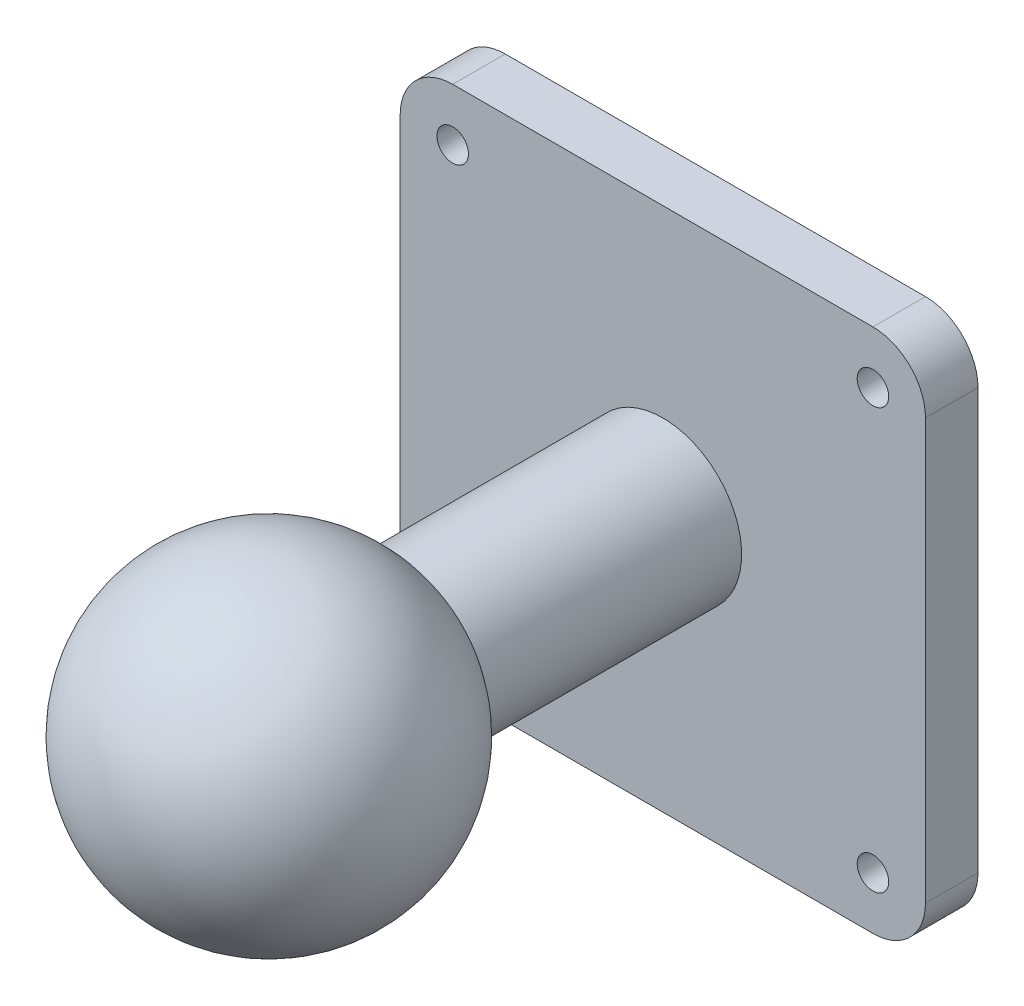
ISO-10303-21;
HEADER;
FILE_DESCRIPTION(('STEP AP214'),'2;1');
FILE_NAME('part.step','',(''),(''),'','','');
FILE_SCHEMA(('AUTOMOTIVE_DESIGN { 1 0 10303 214 1 1 1 1 }'));
ENDSEC;
DATA;
#1=APPLICATION_CONTEXT('core data for automotive mechanical design processes');
#2=APPLICATION_PROTOCOL_DEFINITION('international standard','automotive_design',2000,#1);
#3=PRODUCT_CONTEXT('',#1,'mechanical');
#4=PRODUCT('Part','Part','',(#3));
#5=PRODUCT_RELATED_PRODUCT_CATEGORY('part','',(#4));
#6=PRODUCT_DEFINITION_FORMATION('','',#4);
#7=PRODUCT_DEFINITION_CONTEXT('part definition',#1,'design');
#8=PRODUCT_DEFINITION('design','',#6,#7);
#9=PRODUCT_DEFINITION_SHAPE('','',#8);
#10=(LENGTH_UNIT() NAMED_UNIT(*) SI_UNIT(.MILLI.,.METRE.));
#11=(NAMED_UNIT(*) PLANE_ANGLE_UNIT() SI_UNIT($,.RADIAN.));
#12=(NAMED_UNIT(*) SI_UNIT($,.STERADIAN.) SOLID_ANGLE_UNIT());
#13=UNCERTAINTY_MEASURE_WITH_UNIT(LENGTH_MEASURE(1.E-05),#10,'distance_accuracy_value','');
#14=(GEOMETRIC_REPRESENTATION_CONTEXT(3) GLOBAL_UNCERTAINTY_ASSIGNED_CONTEXT((#13)) GLOBAL_UNIT_ASSIGNED_CONTEXT((#10,
#11,#12)) REPRESENTATION_CONTEXT('',''));
#15=CARTESIAN_POINT('',(0.,0.,0.));
#16=DIRECTION('',(0.,0.,1.));
#17=DIRECTION('',(1.,0.,0.));
#18=AXIS2_PLACEMENT_3D('',#15,#16,#17);
#19=CARTESIAN_POINT('',(25.,-25.,5.));
#20=DIRECTION('',(-1.,0.,0.));
#21=DIRECTION('',(0.,0.,1.));
#22=AXIS2_PLACEMENT_3D('',#19,#20,#21);
#23=PLANE('',#22);
#24=DIRECTION('',(0.,1.,0.));
#25=VECTOR('',#24,1.);
#26=CARTESIAN_POINT('',(25.,-25.,5.));
#27=LINE('',#26,#25);
#28=CARTESIAN_POINT('',(25.,-20.,5.));
#29=VERTEX_POINT('',#28);
#30=CARTESIAN_POINT('',(25.,20.,5.));
#31=VERTEX_POINT('',#30);
#32=EDGE_CURVE('E130',#29,#31,#27,.T.);
#33=ORIENTED_EDGE('',*,*,#32,.F.);
#34=DIRECTION('',(0.,0.,-1.));
#35=VECTOR('',#34,1.);
#36=CARTESIAN_POINT('',(25.,-20.,5.));
#37=LINE('',#36,#35);
#38=CARTESIAN_POINT('',(25.,-20.,0.));
#39=VERTEX_POINT('',#38);
#40=EDGE_CURVE('E115',#29,#39,#37,.T.);
#41=ORIENTED_EDGE('',*,*,#40,.T.);
#42=DIRECTION('',(0.,1.,0.));
#43=VECTOR('',#42,1.);
#44=CARTESIAN_POINT('',(25.,-25.,0.));
#45=LINE('',#44,#43);
#46=CARTESIAN_POINT('',(25.,20.,0.));
#47=VERTEX_POINT('',#46);
#48=EDGE_CURVE('E127',#39,#47,#45,.T.);
#49=ORIENTED_EDGE('',*,*,#48,.T.);
#50=DIRECTION('',(0.,0.,-1.));
#51=VECTOR('',#50,1.);
#52=CARTESIAN_POINT('',(25.,20.,5.));
#53=LINE('',#52,#51);
#54=EDGE_CURVE('E132',#47,#31,#53,.F.);
#55=ORIENTED_EDGE('',*,*,#54,.T.);
#56=EDGE_LOOP('',(#33,#41,#49,#55));
#57=FACE_BOUND('',#56,.T.);
#58=ADVANCED_FACE('F45',(#57),#23,.F.);
#59=CARTESIAN_POINT('',(-25.,25.,5.));
#60=DIRECTION('',(0.,-1.,0.));
#61=DIRECTION('',(0.,0.,-1.));
#62=AXIS2_PLACEMENT_3D('',#59,#60,#61);
#63=PLANE('',#62);
#64=DIRECTION('',(-1.,0.,0.));
#65=VECTOR('',#64,1.);
#66=CARTESIAN_POINT('',(-25.,25.,5.));
#67=LINE('',#66,#65);
#68=CARTESIAN_POINT('',(20.,25.,5.));
#69=VERTEX_POINT('',#68);
#70=CARTESIAN_POINT('',(-20.,25.,5.));
#71=VERTEX_POINT('',#70);
#72=EDGE_CURVE('E177',#69,#71,#67,.T.);
#73=ORIENTED_EDGE('',*,*,#72,.F.);
#74=DIRECTION('',(0.,0.,-1.));
#75=VECTOR('',#74,1.);
#76=CARTESIAN_POINT('',(20.,25.,5.));
#77=LINE('',#76,#75);
#78=CARTESIAN_POINT('',(20.,25.,0.));
#79=VERTEX_POINT('',#78);
#80=EDGE_CURVE('E170',#69,#79,#77,.T.);
#81=ORIENTED_EDGE('',*,*,#80,.T.);
#82=DIRECTION('',(-1.,0.,0.));
#83=VECTOR('',#82,1.);
#84=CARTESIAN_POINT('',(-25.,25.,0.));
#85=LINE('',#84,#83);
#86=CARTESIAN_POINT('',(-20.,25.,0.));
#87=VERTEX_POINT('',#86);
#88=EDGE_CURVE('E136',#79,#87,#85,.T.);
#89=ORIENTED_EDGE('',*,*,#88,.T.);
#90=DIRECTION('',(0.,0.,-1.));
#91=VECTOR('',#90,1.);
#92=CARTESIAN_POINT('',(-20.,25.,5.));
#93=LINE('',#92,#91);
#94=EDGE_CURVE('E168',#87,#71,#93,.F.);
#95=ORIENTED_EDGE('',*,*,#94,.T.);
#96=EDGE_LOOP('',(#73,#81,#89,#95));
#97=FACE_BOUND('',#96,.T.);
#98=ADVANCED_FACE('F175',(#97),#63,.F.);
#99=CARTESIAN_POINT('',(-25.,-25.,5.));
#100=DIRECTION('',(1.,0.,0.));
#101=DIRECTION('',(0.,0.,-1.));
#102=AXIS2_PLACEMENT_3D('',#99,#100,#101);
#103=PLANE('',#102);
#104=DIRECTION('',(0.,-1.,0.));
#105=VECTOR('',#104,1.);
#106=CARTESIAN_POINT('',(-25.,-25.,5.));
#107=LINE('',#106,#105);
#108=CARTESIAN_POINT('',(-25.,20.,5.));
#109=VERTEX_POINT('',#108);
#110=CARTESIAN_POINT('',(-25.,-20.,5.));
#111=VERTEX_POINT('',#110);
#112=EDGE_CURVE('E185',#109,#111,#107,.T.);
#113=ORIENTED_EDGE('',*,*,#112,.F.);
#114=DIRECTION('',(0.,0.,-1.));
#115=VECTOR('',#114,1.);
#116=CARTESIAN_POINT('',(-25.,20.,5.));
#117=LINE('',#116,#115);
#118=CARTESIAN_POINT('',(-25.,20.,0.));
#119=VERTEX_POINT('',#118);
#120=EDGE_CURVE('E11',#109,#119,#117,.T.);
#121=ORIENTED_EDGE('',*,*,#120,.T.);
#122=DIRECTION('',(0.,-1.,0.));
#123=VECTOR('',#122,1.);
#124=CARTESIAN_POINT('',(-25.,-25.,0.));
#125=LINE('',#124,#123);
#126=CARTESIAN_POINT('',(-25.,-20.,0.));
#127=VERTEX_POINT('',#126);
#128=EDGE_CURVE('E140',#119,#127,#125,.T.);
#129=ORIENTED_EDGE('',*,*,#128,.T.);
#130=DIRECTION('',(0.,0.,-1.));
#131=VECTOR('',#130,1.);
#132=CARTESIAN_POINT('',(-25.,-20.,5.));
#133=LINE('',#132,#131);
#134=EDGE_CURVE('E53',#127,#111,#133,.F.);
#135=ORIENTED_EDGE('',*,*,#134,.T.);
#136=EDGE_LOOP('',(#113,#121,#129,#135));
#137=FACE_BOUND('',#136,.T.);
#138=ADVANCED_FACE('F184',(#137),#103,.F.);
#139=CARTESIAN_POINT('',(-25.,-25.,5.));
#140=DIRECTION('',(0.,1.,0.));
#141=DIRECTION('',(0.,0.,1.));
#142=AXIS2_PLACEMENT_3D('',#139,#140,#141);
#143=PLANE('',#142);
#144=DIRECTION('',(1.,0.,0.));
#145=VECTOR('',#144,1.);
#146=CARTESIAN_POINT('',(-25.,-25.,0.));
#147=LINE('',#146,#145);
#148=CARTESIAN_POINT('',(-20.,-25.,0.));
#149=VERTEX_POINT('',#148);
#150=CARTESIAN_POINT('',(20.,-25.,0.));
#151=VERTEX_POINT('',#150);
#152=EDGE_CURVE('E150',#149,#151,#147,.T.);
#153=ORIENTED_EDGE('',*,*,#152,.T.);
#154=DIRECTION('',(0.,0.,-1.));
#155=VECTOR('',#154,1.);
#156=CARTESIAN_POINT('',(20.,-25.,5.));
#157=LINE('',#156,#155);
#158=CARTESIAN_POINT('',(20.,-25.,5.));
#159=VERTEX_POINT('',#158);
#160=EDGE_CURVE('E116',#151,#159,#157,.F.);
#161=ORIENTED_EDGE('',*,*,#160,.T.);
#162=DIRECTION('',(1.,0.,0.));
#163=VECTOR('',#162,1.);
#164=CARTESIAN_POINT('',(-25.,-25.,5.));
#165=LINE('',#164,#163);
#166=CARTESIAN_POINT('',(-20.,-25.,5.));
#167=VERTEX_POINT('',#166);
#168=EDGE_CURVE('E146',#167,#159,#165,.T.);
#169=ORIENTED_EDGE('',*,*,#168,.F.);
#170=DIRECTION('',(0.,0.,-1.));
#171=VECTOR('',#170,1.);
#172=CARTESIAN_POINT('',(-20.,-25.,5.));
#173=LINE('',#172,#171);
#174=EDGE_CURVE('E121',#167,#149,#173,.T.);
#175=ORIENTED_EDGE('',*,*,#174,.T.);
#176=EDGE_LOOP('',(#153,#161,#169,#175));
#177=FACE_BOUND('',#176,.T.);
#178=ADVANCED_FACE('F222',(#177),#143,.F.);
#179=CARTESIAN_POINT('',(0.,0.,5.));
#180=DIRECTION('',(0.,0.,-1.));
#181=DIRECTION('',(-1.,0.,0.));
#182=AXIS2_PLACEMENT_3D('',#179,#180,#181);
#183=PLANE('',#182);
#184=CARTESIAN_POINT('',(-20.,-20.,5.));
#185=DIRECTION('',(0.,0.,1.));
#186=DIRECTION('',(-1.,0.,0.));
#187=AXIS2_PLACEMENT_3D('',#184,#185,#186);
#188=CIRCLE('',#187,1.5);
#189=CARTESIAN_POINT('',(-21.5,-20.,5.));
#190=VERTEX_POINT('',#189);
#191=EDGE_CURVE('E202',#190,#190,#188,.T.);
#192=ORIENTED_EDGE('',*,*,#191,.F.);
#193=EDGE_LOOP('',(#192));
#194=FACE_BOUND('',#193,.T.);
#195=CARTESIAN_POINT('',(20.,-20.,5.));
#196=DIRECTION('',(0.,0.,1.));
#197=DIRECTION('',(1.,0.,0.));
#198=AXIS2_PLACEMENT_3D('',#195,#196,#197);
#199=CIRCLE('',#198,1.5);
#200=CARTESIAN_POINT('',(21.5,-20.,5.));
#201=VERTEX_POINT('',#200);
#202=EDGE_CURVE('E208',#201,#201,#199,.T.);
#203=ORIENTED_EDGE('',*,*,#202,.F.);
#204=EDGE_LOOP('',(#203));
#205=FACE_BOUND('',#204,.T.);
#206=CARTESIAN_POINT('',(20.,20.,5.));
#207=DIRECTION('',(0.,0.,1.));
#208=DIRECTION('',(-1.,0.,0.));
#209=AXIS2_PLACEMENT_3D('',#206,#207,#208);
#210=CIRCLE('',#209,1.5);
#211=CARTESIAN_POINT('',(18.5,20.,5.));
#212=VERTEX_POINT('',#211);
#213=EDGE_CURVE('E196',#212,#212,#210,.T.);
#214=ORIENTED_EDGE('',*,*,#213,.F.);
#215=EDGE_LOOP('',(#214));
#216=FACE_BOUND('',#215,.T.);
#217=CARTESIAN_POINT('',(-20.,20.,5.));
#218=DIRECTION('',(0.,0.,1.));
#219=DIRECTION('',(1.,0.,0.));
#220=AXIS2_PLACEMENT_3D('',#217,#218,#219);
#221=CIRCLE('',#220,1.5);
#222=CARTESIAN_POINT('',(-18.5,20.,5.));
#223=VERTEX_POINT('',#222);
#224=EDGE_CURVE('E193',#223,#223,#221,.T.);
#225=ORIENTED_EDGE('',*,*,#224,.F.);
#226=EDGE_LOOP('',(#225));
#227=FACE_BOUND('',#226,.T.);
#228=CARTESIAN_POINT('',(0.,0.,5.));
#229=DIRECTION('',(0.,0.,1.));
#230=DIRECTION('',(1.,0.,0.));
#231=AXIS2_PLACEMENT_3D('',#228,#229,#230);
#232=CIRCLE('',#231,7.5);
#233=CARTESIAN_POINT('',(-7.5,0.,5.));
#234=VERTEX_POINT('',#233);
#235=EDGE_CURVE('E152',#234,#234,#232,.T.);
#236=ORIENTED_EDGE('',*,*,#235,.F.);
#237=EDGE_LOOP('',(#236));
#238=FACE_BOUND('',#237,.T.);
#239=ORIENTED_EDGE('',*,*,#168,.T.);
#240=CARTESIAN_POINT('',(20.,-20.,5.));
#241=DIRECTION('',(0.,0.,-1.));
#242=DIRECTION('',(-1.,0.,0.));
#243=AXIS2_PLACEMENT_3D('',#240,#241,#242);
#244=CIRCLE('',#243,5.);
#245=EDGE_CURVE('E166',#159,#29,#244,.F.);
#246=ORIENTED_EDGE('',*,*,#245,.T.);
#247=ORIENTED_EDGE('',*,*,#32,.T.);
#248=CARTESIAN_POINT('',(20.,20.,5.));
#249=DIRECTION('',(0.,0.,-1.));
#250=DIRECTION('',(-1.,0.,0.));
#251=AXIS2_PLACEMENT_3D('',#248,#249,#250);
#252=CIRCLE('',#251,5.);
#253=EDGE_CURVE('E164',#31,#69,#252,.F.);
#254=ORIENTED_EDGE('',*,*,#253,.T.);
#255=ORIENTED_EDGE('',*,*,#72,.T.);
#256=CARTESIAN_POINT('',(-20.,20.,5.));
#257=DIRECTION('',(0.,0.,-1.));
#258=DIRECTION('',(-1.,0.,0.));
#259=AXIS2_PLACEMENT_3D('',#256,#257,#258);
#260=CIRCLE('',#259,5.);
#261=EDGE_CURVE('E66',#71,#109,#260,.F.);
#262=ORIENTED_EDGE('',*,*,#261,.T.);
#263=ORIENTED_EDGE('',*,*,#112,.T.);
#264=CARTESIAN_POINT('',(-20.,-20.,5.));
#265=DIRECTION('',(0.,0.,-1.));
#266=DIRECTION('',(-1.,0.,0.));
#267=AXIS2_PLACEMENT_3D('',#264,#265,#266);
#268=CIRCLE('',#267,5.);
#269=EDGE_CURVE('E161',#111,#167,#268,.F.);
#270=ORIENTED_EDGE('',*,*,#269,.T.);
#271=EDGE_LOOP('',(#239,#246,#247,#254,#255,#262,#263,#270));
#272=FACE_BOUND('',#271,.T.);
#273=ADVANCED_FACE('F219',(#194,#205,#216,#227,#238,#272),#183,.F.);
#274=CARTESIAN_POINT('',(0.,0.,0.));
#275=DIRECTION('',(0.,0.,-1.));
#276=DIRECTION('',(-1.,0.,0.));
#277=AXIS2_PLACEMENT_3D('',#274,#275,#276);
#278=PLANE('',#277);
#279=CARTESIAN_POINT('',(-20.,-20.,0.));
#280=DIRECTION('',(0.,0.,1.));
#281=DIRECTION('',(-1.,0.,0.));
#282=AXIS2_PLACEMENT_3D('',#279,#280,#281);
#283=CIRCLE('',#282,1.5);
#284=CARTESIAN_POINT('',(-21.5,-20.,0.));
#285=VERTEX_POINT('',#284);
#286=EDGE_CURVE('E199',#285,#285,#283,.T.);
#287=ORIENTED_EDGE('',*,*,#286,.T.);
#288=EDGE_LOOP('',(#287));
#289=FACE_BOUND('',#288,.T.);
#290=CARTESIAN_POINT('',(20.,-20.,0.));
#291=DIRECTION('',(0.,0.,1.));
#292=DIRECTION('',(1.,0.,0.));
#293=AXIS2_PLACEMENT_3D('',#290,#291,#292);
#294=CIRCLE('',#293,1.5);
#295=CARTESIAN_POINT('',(21.5,-20.,0.));
#296=VERTEX_POINT('',#295);
#297=EDGE_CURVE('E205',#296,#296,#294,.T.);
#298=ORIENTED_EDGE('',*,*,#297,.T.);
#299=EDGE_LOOP('',(#298));
#300=FACE_BOUND('',#299,.T.);
#301=CARTESIAN_POINT('',(20.,20.,0.));
#302=DIRECTION('',(0.,0.,1.));
#303=DIRECTION('',(-1.,0.,0.));
#304=AXIS2_PLACEMENT_3D('',#301,#302,#303);
#305=CIRCLE('',#304,1.5);
#306=CARTESIAN_POINT('',(18.5,20.,0.));
#307=VERTEX_POINT('',#306);
#308=EDGE_CURVE('E211',#307,#307,#305,.T.);
#309=ORIENTED_EDGE('',*,*,#308,.T.);
#310=EDGE_LOOP('',(#309));
#311=FACE_BOUND('',#310,.T.);
#312=CARTESIAN_POINT('',(-20.,20.,0.));
#313=DIRECTION('',(0.,0.,1.));
#314=DIRECTION('',(1.,0.,0.));
#315=AXIS2_PLACEMENT_3D('',#312,#313,#314);
#316=CIRCLE('',#315,1.5);
#317=CARTESIAN_POINT('',(-18.5,20.,0.));
#318=VERTEX_POINT('',#317);
#319=EDGE_CURVE('E143',#318,#318,#316,.T.);
#320=ORIENTED_EDGE('',*,*,#319,.T.);
#321=EDGE_LOOP('',(#320));
#322=FACE_BOUND('',#321,.T.);
#323=ORIENTED_EDGE('',*,*,#48,.F.);
#324=CARTESIAN_POINT('',(20.,-20.,0.));
#325=DIRECTION('',(0.,0.,-1.));
#326=DIRECTION('',(-1.,0.,0.));
#327=AXIS2_PLACEMENT_3D('',#324,#325,#326);
#328=CIRCLE('',#327,5.);
#329=EDGE_CURVE('E111',#39,#151,#328,.T.);
#330=ORIENTED_EDGE('',*,*,#329,.T.);
#331=ORIENTED_EDGE('',*,*,#152,.F.);
#332=CARTESIAN_POINT('',(-20.,-20.,0.));
#333=DIRECTION('',(0.,0.,-1.));
#334=DIRECTION('',(-1.,0.,0.));
#335=AXIS2_PLACEMENT_3D('',#332,#333,#334);
#336=CIRCLE('',#335,5.);
#337=EDGE_CURVE('E131',#149,#127,#336,.T.);
#338=ORIENTED_EDGE('',*,*,#337,.T.);
#339=ORIENTED_EDGE('',*,*,#128,.F.);
#340=CARTESIAN_POINT('',(-20.,20.,0.));
#341=DIRECTION('',(0.,0.,-1.));
#342=DIRECTION('',(-1.,0.,0.));
#343=AXIS2_PLACEMENT_3D('',#340,#341,#342);
#344=CIRCLE('',#343,5.);
#345=EDGE_CURVE('E155',#119,#87,#344,.T.);
#346=ORIENTED_EDGE('',*,*,#345,.T.);
#347=ORIENTED_EDGE('',*,*,#88,.F.);
#348=CARTESIAN_POINT('',(20.,20.,0.));
#349=DIRECTION('',(0.,0.,-1.));
#350=DIRECTION('',(-1.,0.,0.));
#351=AXIS2_PLACEMENT_3D('',#348,#349,#350);
#352=CIRCLE('',#351,5.);
#353=EDGE_CURVE('E122',#79,#47,#352,.T.);
#354=ORIENTED_EDGE('',*,*,#353,.T.);
#355=EDGE_LOOP('',(#323,#330,#331,#338,#339,#346,#347,#354));
#356=FACE_BOUND('',#355,.T.);
#357=ADVANCED_FACE('F134',(#289,#300,#311,#322,#356),#278,.T.);
#358=CARTESIAN_POINT('',(0.,0.,57.501));
#359=DIRECTION('',(0.,0.,-1.));
#360=DIRECTION('',(-1.,0.,0.));
#361=AXIS2_PLACEMENT_3D('',#358,#359,#360);
#362=CYLINDRICAL_SURFACE('',#361,7.5);
#363=CARTESIAN_POINT('',(0.,0.,29.5096189432334));
#364=DIRECTION('',(0.,0.,1.));
#365=DIRECTION('',(1.,0.,0.));
#366=AXIS2_PLACEMENT_3D('',#363,#364,#365);
#367=CIRCLE('',#366,7.5);
#368=CARTESIAN_POINT('',(-7.5,0.,29.5096189432334));
#369=VERTEX_POINT('',#368);
#370=EDGE_CURVE('E137',#369,#369,#367,.T.);
#371=CARTESIAN_POINT('',(-7.5,0.,5.));
#372=CARTESIAN_POINT('',(-7.5,0.,5.25530853065868));
#373=CARTESIAN_POINT('',(-7.5,0.,5.51061706131736));
#374=CARTESIAN_POINT('',(-7.5,0.,6.02123412263472));
#375=CARTESIAN_POINT('',(-7.5,0.,6.27654265329341));
#376=CARTESIAN_POINT('',(-7.5,0.,6.78715971461077));
#377=CARTESIAN_POINT('',(-7.5,0.,7.04246824526945));
#378=CARTESIAN_POINT('',(-7.5,0.,7.55308530658681));
#379=CARTESIAN_POINT('',(-7.5,0.,7.8083938372455));
#380=CARTESIAN_POINT('',(-7.5,0.,8.31901089856286));
#381=CARTESIAN_POINT('',(-7.5,0.,8.57431942922154));
#382=CARTESIAN_POINT('',(-7.5,0.,9.0849364905389));
#383=CARTESIAN_POINT('',(-7.5,0.,9.34024502119758));
#384=CARTESIAN_POINT('',(-7.5,0.,9.85086208251494));
#385=CARTESIAN_POINT('',(-7.5,0.,10.1061706131736));
#386=CARTESIAN_POINT('',(-7.5,0.,10.616787674491));
#387=CARTESIAN_POINT('',(-7.5,0.,10.8720962051497));
#388=CARTESIAN_POINT('',(-7.5,0.,11.382713266467));
#389=CARTESIAN_POINT('',(-7.5,0.,11.6380217971257));
#390=CARTESIAN_POINT('',(-7.5,0.,12.1486388584431));
#391=CARTESIAN_POINT('',(-7.5,0.,12.4039473891018));
#392=CARTESIAN_POINT('',(-7.5,0.,12.9145644504191));
#393=CARTESIAN_POINT('',(-7.5,0.,13.1698729810778));
#394=CARTESIAN_POINT('',(-7.5,0.,13.6804900423952));
#395=CARTESIAN_POINT('',(-7.5,0.,13.9357985730538));
#396=CARTESIAN_POINT('',(-7.5,0.,14.4464156343712));
#397=CARTESIAN_POINT('',(-7.5,0.,14.7017241650299));
#398=CARTESIAN_POINT('',(-7.5,0.,15.2123412263473));
#399=CARTESIAN_POINT('',(-7.5,0.,15.4676497570059));
#400=CARTESIAN_POINT('',(-7.5,0.,15.9782668183233));
#401=CARTESIAN_POINT('',(-7.5,0.,16.233575348982));
#402=CARTESIAN_POINT('',(-7.5,0.,16.7441924102993));
#403=CARTESIAN_POINT('',(-7.5,0.,16.999500940958));
#404=CARTESIAN_POINT('',(-7.5,0.,17.5101180022754));
#405=CARTESIAN_POINT('',(-7.5,0.,17.7654265329341));
#406=CARTESIAN_POINT('',(-7.5,0.,18.2760435942514));
#407=CARTESIAN_POINT('',(-7.5,0.,18.5313521249101));
#408=CARTESIAN_POINT('',(-7.5,0.,19.0419691862275));
#409=CARTESIAN_POINT('',(-7.5,0.,19.2972777168862));
#410=CARTESIAN_POINT('',(-7.5,0.,19.8078947782035));
#411=CARTESIAN_POINT('',(-7.5,0.,20.0632033088622));
#412=CARTESIAN_POINT('',(-7.5,0.,20.5738203701796));
#413=CARTESIAN_POINT('',(-7.5,0.,20.8291289008382));
#414=CARTESIAN_POINT('',(-7.5,0.,21.3397459621556));
#415=CARTESIAN_POINT('',(-7.5,0.,21.5950544928143));
#416=CARTESIAN_POINT('',(-7.5,0.,22.1056715541317));
#417=CARTESIAN_POINT('',(-7.5,0.,22.3609800847903));
#418=CARTESIAN_POINT('',(-7.5,0.,22.8715971461077));
#419=CARTESIAN_POINT('',(-7.5,0.,23.1269056767664));
#420=CARTESIAN_POINT('',(-7.5,0.,23.6375227380837));
#421=CARTESIAN_POINT('',(-7.5,0.,23.8928312687424));
#422=CARTESIAN_POINT('',(-7.5,0.,24.4034483300598));
#423=CARTESIAN_POINT('',(-7.5,0.,24.6587568607185));
#424=CARTESIAN_POINT('',(-7.5,0.,25.1693739220358));
#425=CARTESIAN_POINT('',(-7.5,0.,25.4246824526945));
#426=CARTESIAN_POINT('',(-7.5,0.,25.9352995140119));
#427=CARTESIAN_POINT('',(-7.5,0.,26.1906080446706));
#428=CARTESIAN_POINT('',(-7.5,0.,26.7012251059879));
#429=CARTESIAN_POINT('',(-7.5,0.,26.9565336366466));
#430=CARTESIAN_POINT('',(-7.5,0.,27.467150697964));
#431=CARTESIAN_POINT('',(-7.5,0.,27.7224592286226));
#432=CARTESIAN_POINT('',(-7.5,0.,28.23307628994));
#433=CARTESIAN_POINT('',(-7.5,0.,28.4883848205987));
#434=CARTESIAN_POINT('',(-7.5,0.,28.9990018819161));
#435=CARTESIAN_POINT('',(-7.5,0.,29.2543104125747));
#436=CARTESIAN_POINT('',(-7.5,0.,29.5096189432334));
#437=B_SPLINE_CURVE_WITH_KNOTS('',3,(#371,#372,#373,#374,#375,#376,#377,#378,#379,#380,#381,
#382,#383,#384,#385,#386,#387,#388,#389,#390,#391,#392,#393,#394,#395,#396,#397,#398,#399,#400,
#401,#402,#403,#404,#405,#406,#407,#408,#409,#410,#411,#412,#413,#414,#415,#416,#417,#418,#419,
#420,#421,#422,#423,#424,#425,#426,#427,#428,#429,#430,#431,#432,#433,#434,#435,#436),
.UNSPECIFIED.,.F.,.F.,(4,2,2,2,2,2,2,2,2,2,2,2,2,2,2,2,2,2,2,2,2,2,2,2,2,2,2,2,2,2,2,2,4),(0.,
0.765925591976045,1.53185118395209,2.29777677592814,3.06370236790418,3.82962795988022,
4.59555355185626,5.36147914383231,6.12740473580835,6.8933303277844,7.65925591976045,
8.42518151173649,9.19110710371253,9.95703269568858,10.7229582876646,11.4888838796407,
12.2548094716167,13.0207350635928,13.7866606555688,14.5525862475448,15.3185118395209,
16.0844374314969,16.850363023473,17.616288615449,18.3822142074251,19.1481397994011,
19.9140653913772,20.6799909833532,21.4459165753292,22.2118421673053,22.9777677592813,
23.7436933512574,24.5096189432334),.UNSPECIFIED.);
#438=EDGE_CURVE('BSEAM309',#234,#369,#437,.T.);
#439=ORIENTED_EDGE('',*,*,#235,.T.);
#440=ORIENTED_EDGE('',*,*,#370,.F.);
#441=ORIENTED_EDGE('',*,*,#438,.T.);
#442=ORIENTED_EDGE('',*,*,#438,.F.);
#443=EDGE_LOOP('',(#439,#441,#440,#442));
#444=FACE_BOUND('',#443,.T.);
#445=ADVANCED_FACE('F309',(#444),#362,.T.);
#446=CARTESIAN_POINT('',(0.,0.,42.5));
#447=DIRECTION('',(0.,1.,0.));
#448=DIRECTION('',(1.,0.,0.));
#449=AXIS2_PLACEMENT_3D('',#446,#447,#448);
#450=SPHERICAL_SURFACE('',#449,15.);
#451=CARTESIAN_POINT('',(0.,0.,42.5));
#452=DIRECTION('',(0.,0.,1.));
#453=DIRECTION('',(1.,0.,0.));
#454=AXIS2_PLACEMENT_3D('',#451,#452,#453);
#455=SPHERICAL_SURFACE('',#454,15.);
#456=ORIENTED_EDGE('',*,*,#370,.T.);
#457=EDGE_LOOP('',(#456));
#458=FACE_BOUND('',#457,.T.);
#459=ADVANCED_FACE('F303',(#458),#455,.T.);
#460=CARTESIAN_POINT('',(-20.,20.,0.));
#461=DIRECTION('',(0.,0.,1.));
#462=DIRECTION('',(1.,0.,0.));
#463=AXIS2_PLACEMENT_3D('',#460,#461,#462);
#464=CYLINDRICAL_SURFACE('',#463,1.5);
#465=ORIENTED_EDGE('',*,*,#319,.F.);
#466=EDGE_LOOP('',(#465));
#467=FACE_BOUND('',#466,.T.);
#468=ORIENTED_EDGE('',*,*,#224,.T.);
#469=EDGE_LOOP('',(#468));
#470=FACE_BOUND('',#469,.T.);
#471=ADVANCED_FACE('F294',(#467,#470),#464,.F.);
#472=CARTESIAN_POINT('',(20.,20.,0.));
#473=DIRECTION('',(0.,0.,1.));
#474=DIRECTION('',(1.,0.,0.));
#475=AXIS2_PLACEMENT_3D('',#472,#473,#474);
#476=CYLINDRICAL_SURFACE('',#475,1.5);
#477=ORIENTED_EDGE('',*,*,#308,.F.);
#478=EDGE_LOOP('',(#477));
#479=FACE_BOUND('',#478,.T.);
#480=ORIENTED_EDGE('',*,*,#213,.T.);
#481=EDGE_LOOP('',(#480));
#482=FACE_BOUND('',#481,.T.);
#483=ADVANCED_FACE('F217',(#479,#482),#476,.F.);
#484=CARTESIAN_POINT('',(20.,-20.,0.));
#485=DIRECTION('',(0.,0.,1.));
#486=DIRECTION('',(1.,0.,0.));
#487=AXIS2_PLACEMENT_3D('',#484,#485,#486);
#488=CYLINDRICAL_SURFACE('',#487,1.5);
#489=ORIENTED_EDGE('',*,*,#297,.F.);
#490=EDGE_LOOP('',(#489));
#491=FACE_BOUND('',#490,.T.);
#492=ORIENTED_EDGE('',*,*,#202,.T.);
#493=EDGE_LOOP('',(#492));
#494=FACE_BOUND('',#493,.T.);
#495=ADVANCED_FACE('F277',(#491,#494),#488,.F.);
#496=CARTESIAN_POINT('',(-20.,-20.,0.));
#497=DIRECTION('',(0.,0.,1.));
#498=DIRECTION('',(1.,0.,0.));
#499=AXIS2_PLACEMENT_3D('',#496,#497,#498);
#500=CYLINDRICAL_SURFACE('',#499,1.5);
#501=ORIENTED_EDGE('',*,*,#286,.F.);
#502=EDGE_LOOP('',(#501));
#503=FACE_BOUND('',#502,.T.);
#504=ORIENTED_EDGE('',*,*,#191,.T.);
#505=EDGE_LOOP('',(#504));
#506=FACE_BOUND('',#505,.T.);
#507=ADVANCED_FACE('F248',(#503,#506),#500,.F.);
#508=CARTESIAN_POINT('',(20.,-20.,5.));
#509=DIRECTION('',(0.,0.,-1.));
#510=DIRECTION('',(-1.,0.,0.));
#511=AXIS2_PLACEMENT_3D('',#508,#509,#510);
#512=CYLINDRICAL_SURFACE('',#511,5.);
#513=ORIENTED_EDGE('',*,*,#245,.F.);
#514=ORIENTED_EDGE('',*,*,#160,.F.);
#515=ORIENTED_EDGE('',*,*,#329,.F.);
#516=ORIENTED_EDGE('',*,*,#40,.F.);
#517=EDGE_LOOP('',(#513,#514,#515,#516));
#518=FACE_BOUND('',#517,.T.);
#519=ADVANCED_FACE('F114',(#518),#512,.T.);
#520=CARTESIAN_POINT('',(20.,20.,5.));
#521=DIRECTION('',(0.,0.,-1.));
#522=DIRECTION('',(-1.,0.,0.));
#523=AXIS2_PLACEMENT_3D('',#520,#521,#522);
#524=CYLINDRICAL_SURFACE('',#523,5.);
#525=ORIENTED_EDGE('',*,*,#253,.F.);
#526=ORIENTED_EDGE('',*,*,#54,.F.);
#527=ORIENTED_EDGE('',*,*,#353,.F.);
#528=ORIENTED_EDGE('',*,*,#80,.F.);
#529=EDGE_LOOP('',(#525,#526,#527,#528));
#530=FACE_BOUND('',#529,.T.);
#531=ADVANCED_FACE('F236',(#530),#524,.T.);
#532=CARTESIAN_POINT('',(-20.,20.,5.));
#533=DIRECTION('',(0.,0.,-1.));
#534=DIRECTION('',(-1.,0.,0.));
#535=AXIS2_PLACEMENT_3D('',#532,#533,#534);
#536=CYLINDRICAL_SURFACE('',#535,5.);
#537=ORIENTED_EDGE('',*,*,#261,.F.);
#538=ORIENTED_EDGE('',*,*,#94,.F.);
#539=ORIENTED_EDGE('',*,*,#345,.F.);
#540=ORIENTED_EDGE('',*,*,#120,.F.);
#541=EDGE_LOOP('',(#537,#538,#539,#540));
#542=FACE_BOUND('',#541,.T.);
#543=ADVANCED_FACE('F183',(#542),#536,.T.);
#544=CARTESIAN_POINT('',(-20.,-20.,5.));
#545=DIRECTION('',(0.,0.,-1.));
#546=DIRECTION('',(-1.,0.,0.));
#547=AXIS2_PLACEMENT_3D('',#544,#545,#546);
#548=CYLINDRICAL_SURFACE('',#547,5.);
#549=ORIENTED_EDGE('',*,*,#269,.F.);
#550=ORIENTED_EDGE('',*,*,#134,.F.);
#551=ORIENTED_EDGE('',*,*,#337,.F.);
#552=ORIENTED_EDGE('',*,*,#174,.F.);
#553=EDGE_LOOP('',(#549,#550,#551,#552));
#554=FACE_BOUND('',#553,.T.);
#555=ADVANCED_FACE('F47',(#554),#548,.T.);
#556=CLOSED_SHELL('',(#58,#98,#138,#178,#273,#357,#445,#459,#471,#483,#495,#507,#519,#531,#543,#555));
#557=MANIFOLD_SOLID_BREP('B2',#556);
#558=ADVANCED_BREP_SHAPE_REPRESENTATION('',(#18,#557),#14);
#559=SHAPE_DEFINITION_REPRESENTATION(#9,#558);
ENDSEC;
END-ISO-10303-21;
